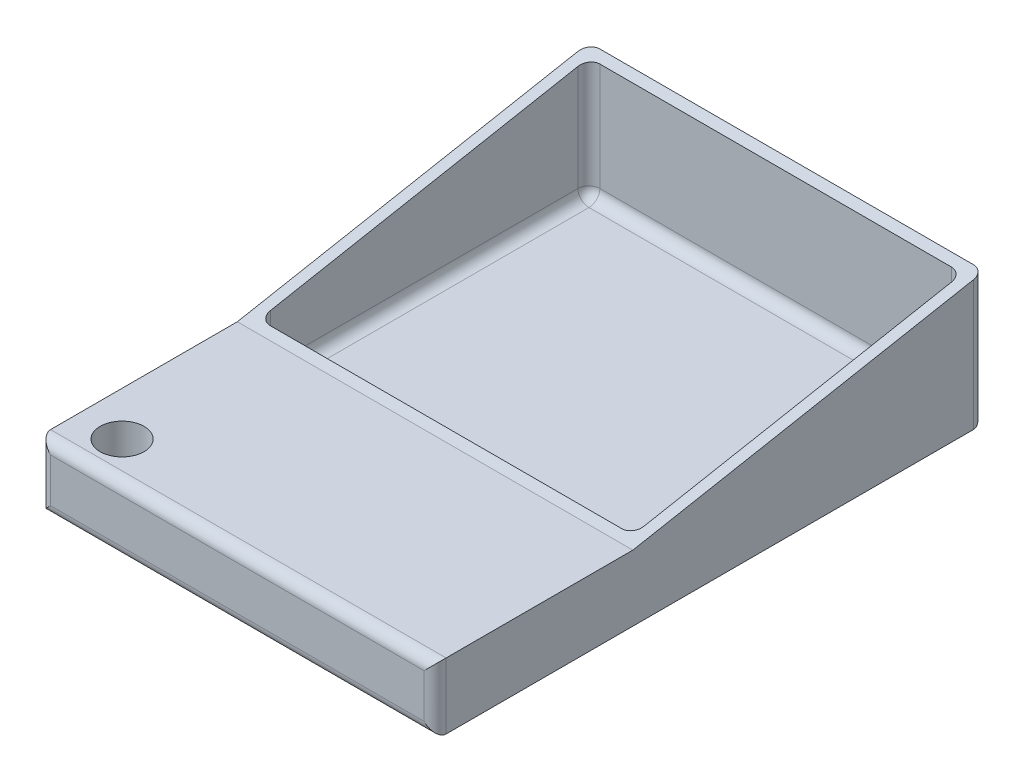
ISO-10303-21;
HEADER;
FILE_DESCRIPTION(('STEP AP214'),'2;1');
FILE_NAME('part.step','',(''),(''),'','','');
FILE_SCHEMA(('AUTOMOTIVE_DESIGN { 1 0 10303 214 1 1 1 1 }'));
ENDSEC;
DATA;
#1=APPLICATION_CONTEXT('core data for automotive mechanical design processes');
#2=APPLICATION_PROTOCOL_DEFINITION('international standard','automotive_design',2000,#1);
#3=PRODUCT_CONTEXT('',#1,'mechanical');
#4=PRODUCT('Part','Part','',(#3));
#5=PRODUCT_RELATED_PRODUCT_CATEGORY('part','',(#4));
#6=PRODUCT_DEFINITION_FORMATION('','',#4);
#7=PRODUCT_DEFINITION_CONTEXT('part definition',#1,'design');
#8=PRODUCT_DEFINITION('design','',#6,#7);
#9=PRODUCT_DEFINITION_SHAPE('','',#8);
#10=(LENGTH_UNIT() NAMED_UNIT(*) SI_UNIT(.MILLI.,.METRE.));
#11=(NAMED_UNIT(*) PLANE_ANGLE_UNIT() SI_UNIT($,.RADIAN.));
#12=(NAMED_UNIT(*) SI_UNIT($,.STERADIAN.) SOLID_ANGLE_UNIT());
#13=UNCERTAINTY_MEASURE_WITH_UNIT(LENGTH_MEASURE(1.E-05),#10,'distance_accuracy_value','');
#14=(GEOMETRIC_REPRESENTATION_CONTEXT(3) GLOBAL_UNCERTAINTY_ASSIGNED_CONTEXT((#13)) GLOBAL_UNIT_ASSIGNED_CONTEXT((#10,
#11,#12)) REPRESENTATION_CONTEXT('',''));
#15=CARTESIAN_POINT('',(0.,0.,0.));
#16=DIRECTION('',(0.,0.,1.));
#17=DIRECTION('',(1.,0.,0.));
#18=AXIS2_PLACEMENT_3D('',#15,#16,#17);
#19=CARTESIAN_POINT('',(90.,30.,-80.));
#20=DIRECTION('',(0.,-0.982872186934322,-0.184288535050185));
#21=DIRECTION('',(0.,0.184288535050185,-0.982872186934322));
#22=AXIS2_PLACEMENT_3D('',#19,#20,#21);
#23=PLANE('',#22);
#24=DIRECTION('',(-1.,0.,0.));
#25=VECTOR('',#24,1.);
#26=CARTESIAN_POINT('',(90.,30.,-80.));
#27=LINE('',#26,#25);
#28=CARTESIAN_POINT('',(87.5,30.,-80.));
#29=VERTEX_POINT('',#28);
#30=CARTESIAN_POINT('',(2.50000000000003,30.,-80.));
#31=VERTEX_POINT('',#30);
#32=EDGE_CURVE('E213',#29,#31,#27,.T.);
#33=ORIENTED_EDGE('',*,*,#32,.T.);
#34=CARTESIAN_POINT('',(2.5,29.53125,-77.5));
#35=DIRECTION('',(0.,-0.982872186934322,-0.184288535050185));
#36=DIRECTION('',(0.,0.184288535050185,-0.982872186934322));
#37=AXIS2_PLACEMENT_3D('',#34,#35,#36);
#38=ELLIPSE('',#37,2.54356571814058,2.5);
#39=CARTESIAN_POINT('',(0.,29.53125,-77.5));
#40=VERTEX_POINT('',#39);
#41=EDGE_CURVE('E191',#31,#40,#38,.F.);
#42=ORIENTED_EDGE('',*,*,#41,.T.);
#43=DIRECTION('',(0.,-0.184288535050185,0.982872186934322));
#44=VECTOR('',#43,1.);
#45=CARTESIAN_POINT('',(0.,30.,-80.));
#46=LINE('',#45,#44);
#47=CARTESIAN_POINT('',(0.,15.,0.));
#48=VERTEX_POINT('',#47);
#49=EDGE_CURVE('E182',#40,#48,#46,.T.);
#50=ORIENTED_EDGE('',*,*,#49,.T.);
#51=DIRECTION('',(-1.,0.,0.));
#52=VECTOR('',#51,1.);
#53=CARTESIAN_POINT('',(90.,15.,0.));
#54=LINE('',#53,#52);
#55=CARTESIAN_POINT('',(90.,15.,0.));
#56=VERTEX_POINT('',#55);
#57=EDGE_CURVE('E188',#56,#48,#54,.T.);
#58=ORIENTED_EDGE('',*,*,#57,.F.);
#59=DIRECTION('',(0.,-0.184288535050185,0.982872186934322));
#60=VECTOR('',#59,1.);
#61=CARTESIAN_POINT('',(90.,30.,-80.));
#62=LINE('',#61,#60);
#63=CARTESIAN_POINT('',(90.,29.53125,-77.5));
#64=VERTEX_POINT('',#63);
#65=EDGE_CURVE('E214',#64,#56,#62,.T.);
#66=ORIENTED_EDGE('',*,*,#65,.F.);
#67=CARTESIAN_POINT('',(87.5,29.53125,-77.5));
#68=DIRECTION('',(0.,-0.982872186934322,-0.184288535050185));
#69=DIRECTION('',(0.,-0.184288535050185,0.982872186934322));
#70=AXIS2_PLACEMENT_3D('',#67,#68,#69);
#71=ELLIPSE('',#70,2.54356571814058,2.5);
#72=EDGE_CURVE('E313',#64,#29,#71,.F.);
#73=ORIENTED_EDGE('',*,*,#72,.T.);
#74=EDGE_LOOP('',(#33,#42,#50,#58,#66,#73));
#75=FACE_BOUND('',#74,.T.);
#76=DIRECTION('',(0.,-0.184288535050185,0.982872186934322));
#77=VECTOR('',#76,1.);
#78=CARTESIAN_POINT('',(2.5,30.,-80.));
#79=LINE('',#78,#77);
#80=CARTESIAN_POINT('',(2.5,29.0625,-75.));
#81=VERTEX_POINT('',#80);
#82=CARTESIAN_POINT('',(2.5,15.9375,-4.99999999999999));
#83=VERTEX_POINT('',#82);
#84=EDGE_CURVE('E413',#81,#83,#79,.T.);
#85=ORIENTED_EDGE('',*,*,#84,.F.);
#86=CARTESIAN_POINT('',(5.,29.0625,-75.));
#87=DIRECTION('',(0.,-0.982872186934322,-0.184288535050185));
#88=DIRECTION('',(0.,-0.184288535050185,0.982872186934322));
#89=AXIS2_PLACEMENT_3D('',#86,#87,#88);
#90=ELLIPSE('',#89,2.54356571814058,2.5);
#91=CARTESIAN_POINT('',(5.,29.53125,-77.5));
#92=VERTEX_POINT('',#91);
#93=EDGE_CURVE('E55',#81,#92,#90,.T.);
#94=ORIENTED_EDGE('',*,*,#93,.T.);
#95=DIRECTION('',(-1.,0.,0.));
#96=VECTOR('',#95,1.);
#97=CARTESIAN_POINT('',(90.,29.53125,-77.5));
#98=LINE('',#97,#96);
#99=CARTESIAN_POINT('',(85.,29.53125,-77.5));
#100=VERTEX_POINT('',#99);
#101=EDGE_CURVE('E405',#100,#92,#98,.T.);
#102=ORIENTED_EDGE('',*,*,#101,.F.);
#103=CARTESIAN_POINT('',(85.,29.0625,-75.));
#104=DIRECTION('',(0.,-0.982872186934322,-0.184288535050185));
#105=DIRECTION('',(0.,0.184288535050185,-0.982872186934322));
#106=AXIS2_PLACEMENT_3D('',#103,#104,#105);
#107=ELLIPSE('',#106,2.54356571814058,2.5);
#108=CARTESIAN_POINT('',(87.5,29.0625,-75.));
#109=VERTEX_POINT('',#108);
#110=EDGE_CURVE('E11',#100,#109,#107,.T.);
#111=ORIENTED_EDGE('',*,*,#110,.T.);
#112=DIRECTION('',(0.,-0.184288535050185,0.982872186934322));
#113=VECTOR('',#112,1.);
#114=CARTESIAN_POINT('',(87.5,30.,-80.));
#115=LINE('',#114,#113);
#116=CARTESIAN_POINT('',(87.5,15.9375,-4.99999999999999));
#117=VERTEX_POINT('',#116);
#118=EDGE_CURVE('E416',#109,#117,#115,.T.);
#119=ORIENTED_EDGE('',*,*,#118,.T.);
#120=CARTESIAN_POINT('',(85.,15.9375,-5.));
#121=DIRECTION('',(0.,-0.982872186934322,-0.184288535050185));
#122=DIRECTION('',(0.,-0.184288535050185,0.982872186934322));
#123=AXIS2_PLACEMENT_3D('',#120,#121,#122);
#124=ELLIPSE('',#123,2.54356571814058,2.5);
#125=CARTESIAN_POINT('',(85.,15.46875,-2.5));
#126=VERTEX_POINT('',#125);
#127=EDGE_CURVE('E321',#117,#126,#124,.T.);
#128=ORIENTED_EDGE('',*,*,#127,.T.);
#129=DIRECTION('',(-1.,0.,0.));
#130=VECTOR('',#129,1.);
#131=CARTESIAN_POINT('',(90.,15.46875,-2.5));
#132=LINE('',#131,#130);
#133=CARTESIAN_POINT('',(5.,15.46875,-2.5));
#134=VERTEX_POINT('',#133);
#135=EDGE_CURVE('E408',#126,#134,#132,.T.);
#136=ORIENTED_EDGE('',*,*,#135,.T.);
#137=CARTESIAN_POINT('',(5.,15.9375,-5.));
#138=DIRECTION('',(0.,-0.982872186934322,-0.184288535050185));
#139=DIRECTION('',(0.,0.184288535050185,-0.982872186934322));
#140=AXIS2_PLACEMENT_3D('',#137,#138,#139);
#141=ELLIPSE('',#140,2.54356571814058,2.5);
#142=EDGE_CURVE('E318',#134,#83,#141,.T.);
#143=ORIENTED_EDGE('',*,*,#142,.T.);
#144=EDGE_LOOP('',(#85,#94,#102,#111,#119,#128,#136,#143));
#145=FACE_BOUND('',#144,.T.);
#146=ADVANCED_FACE('F45',(#75,#145),#23,.F.);
#147=CARTESIAN_POINT('',(90.,0.,0.));
#148=DIRECTION('',(0.,1.,0.));
#149=DIRECTION('',(0.,0.,1.));
#150=AXIS2_PLACEMENT_3D('',#147,#148,#149);
#151=PLANE('',#150);
#152=CARTESIAN_POINT('',(10.,0.,36.22));
#153=DIRECTION('',(0.,-1.,0.));
#154=DIRECTION('',(0.,0.,-1.));
#155=AXIS2_PLACEMENT_3D('',#152,#153,#154);
#156=CIRCLE('',#155,5.);
#157=CARTESIAN_POINT('',(10.,0.,31.22));
#158=VERTEX_POINT('',#157);
#159=EDGE_CURVE('E341',#158,#158,#156,.T.);
#160=ORIENTED_EDGE('',*,*,#159,.F.);
#161=EDGE_LOOP('',(#160));
#162=FACE_BOUND('',#161,.T.);
#163=DIRECTION('',(0.,0.,-1.));
#164=VECTOR('',#163,1.);
#165=CARTESIAN_POINT('',(90.,0.,0.));
#166=LINE('',#165,#164);
#167=CARTESIAN_POINT('',(90.,0.,42.5));
#168=VERTEX_POINT('',#167);
#169=CARTESIAN_POINT('',(90.,0.,-77.5));
#170=VERTEX_POINT('',#169);
#171=EDGE_CURVE('E195',#168,#170,#166,.T.);
#172=ORIENTED_EDGE('',*,*,#171,.F.);
#173=DIRECTION('',(-1.,0.,0.));
#174=VECTOR('',#173,1.);
#175=CARTESIAN_POINT('',(0.,0.,42.5));
#176=LINE('',#175,#174);
#177=CARTESIAN_POINT('',(0.,0.,42.5));
#178=VERTEX_POINT('',#177);
#179=EDGE_CURVE('E252',#168,#178,#176,.T.);
#180=ORIENTED_EDGE('',*,*,#179,.T.);
#181=DIRECTION('',(0.,0.,-1.));
#182=VECTOR('',#181,1.);
#183=CARTESIAN_POINT('',(0.,0.,0.));
#184=LINE('',#183,#182);
#185=CARTESIAN_POINT('',(0.,0.,-77.5));
#186=VERTEX_POINT('',#185);
#187=EDGE_CURVE('E196',#178,#186,#184,.T.);
#188=ORIENTED_EDGE('',*,*,#187,.T.);
#189=DIRECTION('',(-1.,0.,0.));
#190=VECTOR('',#189,1.);
#191=CARTESIAN_POINT('',(90.,0.,-77.5));
#192=LINE('',#191,#190);
#193=EDGE_CURVE('E249',#186,#170,#192,.F.);
#194=ORIENTED_EDGE('',*,*,#193,.T.);
#195=EDGE_LOOP('',(#172,#180,#188,#194));
#196=FACE_BOUND('',#195,.T.);
#197=ADVANCED_FACE('F402',(#162,#196),#151,.F.);
#198=CARTESIAN_POINT('',(90.,0.,-80.));
#199=DIRECTION('',(0.,0.,1.));
#200=DIRECTION('',(1.,0.,0.));
#201=AXIS2_PLACEMENT_3D('',#198,#199,#200);
#202=PLANE('',#201);
#203=DIRECTION('',(-1.,0.,0.));
#204=VECTOR('',#203,1.);
#205=CARTESIAN_POINT('',(90.,2.5,-80.));
#206=LINE('',#205,#204);
#207=CARTESIAN_POINT('',(87.5,2.5,-80.));
#208=VERTEX_POINT('',#207);
#209=CARTESIAN_POINT('',(2.5,2.5,-80.));
#210=VERTEX_POINT('',#209);
#211=EDGE_CURVE('E307',#208,#210,#206,.T.);
#212=ORIENTED_EDGE('',*,*,#211,.T.);
#213=DIRECTION('',(0.,1.,0.));
#214=VECTOR('',#213,1.);
#215=CARTESIAN_POINT('',(2.5,0.,-80.));
#216=LINE('',#215,#214);
#217=EDGE_CURVE('E310',#210,#31,#216,.T.);
#218=ORIENTED_EDGE('',*,*,#217,.T.);
#219=ORIENTED_EDGE('',*,*,#32,.F.);
#220=DIRECTION('',(0.,1.,0.));
#221=VECTOR('',#220,1.);
#222=CARTESIAN_POINT('',(87.5,0.,-80.));
#223=LINE('',#222,#221);
#224=EDGE_CURVE('E71',#29,#208,#223,.F.);
#225=ORIENTED_EDGE('',*,*,#224,.T.);
#226=EDGE_LOOP('',(#212,#218,#219,#225));
#227=FACE_BOUND('',#226,.T.);
#228=ADVANCED_FACE('F397',(#227),#202,.F.);
#229=CARTESIAN_POINT('',(90.,0.,0.));
#230=DIRECTION('',(1.,0.,0.));
#231=DIRECTION('',(0.,0.,-1.));
#232=AXIS2_PLACEMENT_3D('',#229,#230,#231);
#233=PLANE('',#232);
#234=DIRECTION('',(0.,0.,1.));
#235=VECTOR('',#234,1.);
#236=CARTESIAN_POINT('',(90.,15.,0.));
#237=LINE('',#236,#235);
#238=CARTESIAN_POINT('',(90.,15.,42.5));
#239=VERTEX_POINT('',#238);
#240=EDGE_CURVE('E207',#56,#239,#237,.T.);
#241=ORIENTED_EDGE('',*,*,#240,.T.);
#242=DIRECTION('',(0.,-1.,0.));
#243=VECTOR('',#242,1.);
#244=CARTESIAN_POINT('',(90.,0.,42.5));
#245=LINE('',#244,#243);
#246=EDGE_CURVE('E246',#239,#168,#245,.T.);
#247=ORIENTED_EDGE('',*,*,#246,.T.);
#248=ORIENTED_EDGE('',*,*,#171,.T.);
#249=DIRECTION('',(0.,1.,0.));
#250=VECTOR('',#249,1.);
#251=CARTESIAN_POINT('',(90.,30.,-77.5));
#252=LINE('',#251,#250);
#253=EDGE_CURVE('E243',#170,#64,#252,.T.);
#254=ORIENTED_EDGE('',*,*,#253,.T.);
#255=ORIENTED_EDGE('',*,*,#65,.T.);
#256=EDGE_LOOP('',(#241,#247,#248,#254,#255));
#257=FACE_BOUND('',#256,.T.);
#258=ADVANCED_FACE('F395',(#257),#233,.T.);
#259=CARTESIAN_POINT('',(0.,0.,0.));
#260=DIRECTION('',(1.,0.,0.));
#261=DIRECTION('',(0.,0.,-1.));
#262=AXIS2_PLACEMENT_3D('',#259,#260,#261);
#263=PLANE('',#262);
#264=ORIENTED_EDGE('',*,*,#187,.F.);
#265=DIRECTION('',(0.,-1.,0.));
#266=VECTOR('',#265,1.);
#267=CARTESIAN_POINT('',(0.,15.,42.5));
#268=LINE('',#267,#266);
#269=CARTESIAN_POINT('',(0.,15.,42.5));
#270=VERTEX_POINT('',#269);
#271=EDGE_CURVE('E204',#178,#270,#268,.F.);
#272=ORIENTED_EDGE('',*,*,#271,.T.);
#273=DIRECTION('',(0.,0.,-1.));
#274=VECTOR('',#273,1.);
#275=CARTESIAN_POINT('',(0.,15.,0.));
#276=LINE('',#275,#274);
#277=EDGE_CURVE('E200',#270,#48,#276,.T.);
#278=ORIENTED_EDGE('',*,*,#277,.T.);
#279=ORIENTED_EDGE('',*,*,#49,.F.);
#280=DIRECTION('',(0.,1.,0.));
#281=VECTOR('',#280,1.);
#282=CARTESIAN_POINT('',(0.,0.,-77.5));
#283=LINE('',#282,#281);
#284=EDGE_CURVE('E235',#40,#186,#283,.F.);
#285=ORIENTED_EDGE('',*,*,#284,.T.);
#286=EDGE_LOOP('',(#264,#272,#278,#279,#285));
#287=FACE_BOUND('',#286,.T.);
#288=ADVANCED_FACE('F202',(#287),#263,.F.);
#289=CARTESIAN_POINT('',(90.,15.,-2.5));
#290=DIRECTION('',(0.,0.,-1.));
#291=DIRECTION('',(-1.,0.,0.));
#292=AXIS2_PLACEMENT_3D('',#289,#290,#291);
#293=PLANE('',#292);
#294=DIRECTION('',(-1.,0.,0.));
#295=VECTOR('',#294,1.);
#296=CARTESIAN_POINT('',(2.5,5.,-2.5));
#297=LINE('',#296,#295);
#298=CARTESIAN_POINT('',(85.,5.,-2.5));
#299=VERTEX_POINT('',#298);
#300=CARTESIAN_POINT('',(5.,5.,-2.5));
#301=VERTEX_POINT('',#300);
#302=EDGE_CURVE('E290',#299,#301,#297,.T.);
#303=ORIENTED_EDGE('',*,*,#302,.T.);
#304=DIRECTION('',(0.,-1.,0.));
#305=VECTOR('',#304,1.);
#306=CARTESIAN_POINT('',(5.,15.46875,-2.5));
#307=LINE('',#306,#305);
#308=EDGE_CURVE('E293',#301,#134,#307,.F.);
#309=ORIENTED_EDGE('',*,*,#308,.T.);
#310=ORIENTED_EDGE('',*,*,#135,.F.);
#311=DIRECTION('',(0.,-1.,0.));
#312=VECTOR('',#311,1.);
#313=CARTESIAN_POINT('',(85.,15.,-2.5));
#314=LINE('',#313,#312);
#315=EDGE_CURVE('E287',#126,#299,#314,.T.);
#316=ORIENTED_EDGE('',*,*,#315,.T.);
#317=EDGE_LOOP('',(#303,#309,#310,#316));
#318=FACE_BOUND('',#317,.T.);
#319=ADVANCED_FACE('F650',(#318),#293,.T.);
#320=CARTESIAN_POINT('',(90.,2.5,0.));
#321=DIRECTION('',(0.,1.,0.));
#322=DIRECTION('',(0.,0.,1.));
#323=AXIS2_PLACEMENT_3D('',#320,#321,#322);
#324=PLANE('',#323);
#325=DIRECTION('',(0.,0.,-1.));
#326=VECTOR('',#325,1.);
#327=CARTESIAN_POINT('',(85.,2.5,0.));
#328=LINE('',#327,#326);
#329=CARTESIAN_POINT('',(85.,2.5,-5.));
#330=VERTEX_POINT('',#329);
#331=CARTESIAN_POINT('',(85.,2.5,-75.));
#332=VERTEX_POINT('',#331);
#333=EDGE_CURVE('E261',#330,#332,#328,.T.);
#334=ORIENTED_EDGE('',*,*,#333,.T.);
#335=DIRECTION('',(-1.,0.,0.));
#336=VECTOR('',#335,1.);
#337=CARTESIAN_POINT('',(2.5,2.5,-75.));
#338=LINE('',#337,#336);
#339=CARTESIAN_POINT('',(5.,2.5,-75.));
#340=VERTEX_POINT('',#339);
#341=EDGE_CURVE('E264',#332,#340,#338,.T.);
#342=ORIENTED_EDGE('',*,*,#341,.T.);
#343=DIRECTION('',(0.,0.,-1.));
#344=VECTOR('',#343,1.);
#345=CARTESIAN_POINT('',(5.,2.5,-2.5));
#346=LINE('',#345,#344);
#347=CARTESIAN_POINT('',(5.,2.5,-5.));
#348=VERTEX_POINT('',#347);
#349=EDGE_CURVE('E255',#340,#348,#346,.F.);
#350=ORIENTED_EDGE('',*,*,#349,.T.);
#351=DIRECTION('',(-1.,0.,0.));
#352=VECTOR('',#351,1.);
#353=CARTESIAN_POINT('',(87.5,2.5,-5.));
#354=LINE('',#353,#352);
#355=EDGE_CURVE('E258',#348,#330,#354,.F.);
#356=ORIENTED_EDGE('',*,*,#355,.T.);
#357=EDGE_LOOP('',(#334,#342,#350,#356));
#358=FACE_BOUND('',#357,.T.);
#359=ADVANCED_FACE('F641',(#358),#324,.T.);
#360=CARTESIAN_POINT('',(90.,0.,-77.5));
#361=DIRECTION('',(0.,0.,1.));
#362=DIRECTION('',(1.,0.,0.));
#363=AXIS2_PLACEMENT_3D('',#360,#361,#362);
#364=PLANE('',#363);
#365=ORIENTED_EDGE('',*,*,#101,.T.);
#366=DIRECTION('',(0.,1.,0.));
#367=VECTOR('',#366,1.);
#368=CARTESIAN_POINT('',(5.,2.5,-77.5));
#369=LINE('',#368,#367);
#370=CARTESIAN_POINT('',(5.,5.,-77.5));
#371=VERTEX_POINT('',#370);
#372=EDGE_CURVE('E275',#92,#371,#369,.F.);
#373=ORIENTED_EDGE('',*,*,#372,.T.);
#374=DIRECTION('',(-1.,0.,0.));
#375=VECTOR('',#374,1.);
#376=CARTESIAN_POINT('',(87.5,5.,-77.5));
#377=LINE('',#376,#375);
#378=CARTESIAN_POINT('',(85.,5.,-77.5));
#379=VERTEX_POINT('',#378);
#380=EDGE_CURVE('E271',#371,#379,#377,.F.);
#381=ORIENTED_EDGE('',*,*,#380,.T.);
#382=DIRECTION('',(0.,1.,0.));
#383=VECTOR('',#382,1.);
#384=CARTESIAN_POINT('',(85.,0.,-77.5));
#385=LINE('',#384,#383);
#386=EDGE_CURVE('E268',#379,#100,#385,.T.);
#387=ORIENTED_EDGE('',*,*,#386,.T.);
#388=EDGE_LOOP('',(#365,#373,#381,#387));
#389=FACE_BOUND('',#388,.T.);
#390=ADVANCED_FACE('F632',(#389),#364,.T.);
#391=CARTESIAN_POINT('',(87.5,0.,0.));
#392=DIRECTION('',(1.,0.,0.));
#393=DIRECTION('',(0.,0.,-1.));
#394=AXIS2_PLACEMENT_3D('',#391,#392,#393);
#395=PLANE('',#394);
#396=DIRECTION('',(0.,0.,-1.));
#397=VECTOR('',#396,1.);
#398=CARTESIAN_POINT('',(87.5,5.,0.));
#399=LINE('',#398,#397);
#400=CARTESIAN_POINT('',(87.5,5.,-75.));
#401=VERTEX_POINT('',#400);
#402=CARTESIAN_POINT('',(87.5,5.,-5.));
#403=VERTEX_POINT('',#402);
#404=EDGE_CURVE('E281',#401,#403,#399,.F.);
#405=ORIENTED_EDGE('',*,*,#404,.T.);
#406=DIRECTION('',(0.,-1.,0.));
#407=VECTOR('',#406,1.);
#408=CARTESIAN_POINT('',(87.5,0.,-5.));
#409=LINE('',#408,#407);
#410=EDGE_CURVE('E284',#403,#117,#409,.F.);
#411=ORIENTED_EDGE('',*,*,#410,.T.);
#412=ORIENTED_EDGE('',*,*,#118,.F.);
#413=DIRECTION('',(0.,1.,0.));
#414=VECTOR('',#413,1.);
#415=CARTESIAN_POINT('',(87.5,0.,-75.));
#416=LINE('',#415,#414);
#417=EDGE_CURVE('E278',#109,#401,#416,.F.);
#418=ORIENTED_EDGE('',*,*,#417,.T.);
#419=EDGE_LOOP('',(#405,#411,#412,#418));
#420=FACE_BOUND('',#419,.T.);
#421=ADVANCED_FACE('F623',(#420),#395,.F.);
#422=CARTESIAN_POINT('',(2.5,0.,0.));
#423=DIRECTION('',(1.,0.,0.));
#424=DIRECTION('',(0.,0.,-1.));
#425=AXIS2_PLACEMENT_3D('',#422,#423,#424);
#426=PLANE('',#425);
#427=ORIENTED_EDGE('',*,*,#84,.T.);
#428=DIRECTION('',(0.,-1.,0.));
#429=VECTOR('',#428,1.);
#430=CARTESIAN_POINT('',(2.5,2.5,-5.));
#431=LINE('',#430,#429);
#432=CARTESIAN_POINT('',(2.5,5.,-5.));
#433=VERTEX_POINT('',#432);
#434=EDGE_CURVE('E302',#83,#433,#431,.T.);
#435=ORIENTED_EDGE('',*,*,#434,.T.);
#436=DIRECTION('',(0.,0.,-1.));
#437=VECTOR('',#436,1.);
#438=CARTESIAN_POINT('',(2.5,5.,-77.5));
#439=LINE('',#438,#437);
#440=CARTESIAN_POINT('',(2.5,5.,-75.));
#441=VERTEX_POINT('',#440);
#442=EDGE_CURVE('E299',#433,#441,#439,.T.);
#443=ORIENTED_EDGE('',*,*,#442,.T.);
#444=DIRECTION('',(0.,1.,0.));
#445=VECTOR('',#444,1.);
#446=CARTESIAN_POINT('',(2.5,29.53125,-75.));
#447=LINE('',#446,#445);
#448=EDGE_CURVE('E296',#441,#81,#447,.T.);
#449=ORIENTED_EDGE('',*,*,#448,.T.);
#450=EDGE_LOOP('',(#427,#435,#443,#449));
#451=FACE_BOUND('',#450,.T.);
#452=ADVANCED_FACE('F613',(#451),#426,.T.);
#453=CARTESIAN_POINT('',(0.,15.,45.));
#454=DIRECTION('',(0.,0.,1.));
#455=DIRECTION('',(1.,0.,0.));
#456=AXIS2_PLACEMENT_3D('',#453,#454,#455);
#457=PLANE('',#456);
#458=DIRECTION('',(-1.,0.,0.));
#459=VECTOR('',#458,1.);
#460=CARTESIAN_POINT('',(0.,12.5,45.));
#461=LINE('',#460,#459);
#462=CARTESIAN_POINT('',(87.5,12.5,45.));
#463=VERTEX_POINT('',#462);
#464=CARTESIAN_POINT('',(2.5,12.5,45.));
#465=VERTEX_POINT('',#464);
#466=EDGE_CURVE('E228',#463,#465,#461,.T.);
#467=ORIENTED_EDGE('',*,*,#466,.T.);
#468=DIRECTION('',(0.,-1.,0.));
#469=VECTOR('',#468,1.);
#470=CARTESIAN_POINT('',(2.5,0.,45.));
#471=LINE('',#470,#469);
#472=CARTESIAN_POINT('',(2.5,2.5,45.));
#473=VERTEX_POINT('',#472);
#474=EDGE_CURVE('E231',#465,#473,#471,.T.);
#475=ORIENTED_EDGE('',*,*,#474,.T.);
#476=DIRECTION('',(-1.,0.,0.));
#477=VECTOR('',#476,1.);
#478=CARTESIAN_POINT('',(90.,2.5,45.));
#479=LINE('',#478,#477);
#480=CARTESIAN_POINT('',(87.5,2.5,45.));
#481=VERTEX_POINT('',#480);
#482=EDGE_CURVE('E218',#473,#481,#479,.F.);
#483=ORIENTED_EDGE('',*,*,#482,.T.);
#484=DIRECTION('',(0.,-1.,0.));
#485=VECTOR('',#484,1.);
#486=CARTESIAN_POINT('',(87.5,15.,45.));
#487=LINE('',#486,#485);
#488=EDGE_CURVE('E225',#481,#463,#487,.F.);
#489=ORIENTED_EDGE('',*,*,#488,.T.);
#490=EDGE_LOOP('',(#467,#475,#483,#489));
#491=FACE_BOUND('',#490,.T.);
#492=ADVANCED_FACE('F604',(#491),#457,.T.);
#493=CARTESIAN_POINT('',(0.,15.,0.));
#494=DIRECTION('',(0.,1.,0.));
#495=DIRECTION('',(0.,0.,1.));
#496=AXIS2_PLACEMENT_3D('',#493,#494,#495);
#497=PLANE('',#496);
#498=CARTESIAN_POINT('',(10.,15.,36.22));
#499=DIRECTION('',(0.,1.,0.));
#500=DIRECTION('',(0.,0.,1.));
#501=AXIS2_PLACEMENT_3D('',#498,#499,#500);
#502=CIRCLE('',#501,5.);
#503=CARTESIAN_POINT('',(10.,15.,41.22));
#504=VERTEX_POINT('',#503);
#505=EDGE_CURVE('E208',#504,#504,#502,.T.);
#506=ORIENTED_EDGE('',*,*,#505,.F.);
#507=EDGE_LOOP('',(#506));
#508=FACE_BOUND('',#507,.T.);
#509=ORIENTED_EDGE('',*,*,#277,.F.);
#510=DIRECTION('',(-1.,0.,0.));
#511=VECTOR('',#510,1.);
#512=CARTESIAN_POINT('',(0.,15.,42.5));
#513=LINE('',#512,#511);
#514=EDGE_CURVE('E240',#270,#239,#513,.F.);
#515=ORIENTED_EDGE('',*,*,#514,.T.);
#516=ORIENTED_EDGE('',*,*,#240,.F.);
#517=ORIENTED_EDGE('',*,*,#57,.T.);
#518=EDGE_LOOP('',(#509,#515,#516,#517));
#519=FACE_BOUND('',#518,.T.);
#520=ADVANCED_FACE('F210',(#508,#519),#497,.T.);
#521=CARTESIAN_POINT('',(10.,0.,36.22));
#522=DIRECTION('',(0.,-1.,0.));
#523=DIRECTION('',(0.,0.,-1.));
#524=AXIS2_PLACEMENT_3D('',#521,#522,#523);
#525=CYLINDRICAL_SURFACE('',#524,5.);
#526=ORIENTED_EDGE('',*,*,#159,.T.);
#527=EDGE_LOOP('',(#526));
#528=FACE_BOUND('',#527,.T.);
#529=ORIENTED_EDGE('',*,*,#505,.T.);
#530=EDGE_LOOP('',(#529));
#531=FACE_BOUND('',#530,.T.);
#532=ADVANCED_FACE('F433',(#528,#531),#525,.F.);
#533=CARTESIAN_POINT('',(87.5,0.,42.5));
#534=DIRECTION('',(0.,-1.,0.));
#535=DIRECTION('',(0.,0.,-1.));
#536=AXIS2_PLACEMENT_3D('',#533,#534,#535);
#537=CYLINDRICAL_SURFACE('',#536,2.5);
#538=CARTESIAN_POINT('',(87.5,2.5,42.5));
#539=DIRECTION('',(0.707106781186547,0.707106781186547,0.));
#540=DIRECTION('',(0.707106781186547,-0.707106781186547,0.));
#541=AXIS2_PLACEMENT_3D('',#538,#539,#540);
#542=ELLIPSE('',#541,3.53553390593274,2.5);
#543=EDGE_CURVE('E333',#168,#481,#542,.F.);
#544=ORIENTED_EDGE('',*,*,#543,.F.);
#545=ORIENTED_EDGE('',*,*,#246,.F.);
#546=CARTESIAN_POINT('',(87.5,12.5,42.5));
#547=DIRECTION('',(0.707106781186547,-0.707106781186547,0.));
#548=DIRECTION('',(-0.707106781186547,-0.707106781186547,0.));
#549=AXIS2_PLACEMENT_3D('',#546,#547,#548);
#550=ELLIPSE('',#549,3.53553390593274,2.5);
#551=EDGE_CURVE('E337',#463,#239,#550,.F.);
#552=ORIENTED_EDGE('',*,*,#551,.F.);
#553=ORIENTED_EDGE('',*,*,#488,.F.);
#554=EDGE_LOOP('',(#544,#545,#552,#553));
#555=FACE_BOUND('',#554,.T.);
#556=ADVANCED_FACE('F457',(#555),#537,.T.);
#557=CARTESIAN_POINT('',(0.,12.5,42.5));
#558=DIRECTION('',(-1.,0.,0.));
#559=DIRECTION('',(0.,0.,1.));
#560=AXIS2_PLACEMENT_3D('',#557,#558,#559);
#561=CYLINDRICAL_SURFACE('',#560,2.5);
#562=ORIENTED_EDGE('',*,*,#551,.T.);
#563=ORIENTED_EDGE('',*,*,#514,.F.);
#564=CARTESIAN_POINT('',(2.5,12.5,42.5));
#565=DIRECTION('',(-0.707106781186547,-0.707106781186547,0.));
#566=DIRECTION('',(-0.707106781186547,0.707106781186547,0.));
#567=AXIS2_PLACEMENT_3D('',#564,#565,#566);
#568=ELLIPSE('',#567,3.53553390593274,2.5);
#569=EDGE_CURVE('E329',#465,#270,#568,.T.);
#570=ORIENTED_EDGE('',*,*,#569,.F.);
#571=ORIENTED_EDGE('',*,*,#466,.F.);
#572=EDGE_LOOP('',(#562,#563,#570,#571));
#573=FACE_BOUND('',#572,.T.);
#574=ADVANCED_FACE('F453',(#573),#561,.T.);
#575=CARTESIAN_POINT('',(90.,2.5,42.5));
#576=DIRECTION('',(1.,0.,0.));
#577=DIRECTION('',(0.,0.,-1.));
#578=AXIS2_PLACEMENT_3D('',#575,#576,#577);
#579=CYLINDRICAL_SURFACE('',#578,2.5);
#580=ORIENTED_EDGE('',*,*,#543,.T.);
#581=ORIENTED_EDGE('',*,*,#482,.F.);
#582=CARTESIAN_POINT('',(2.5,2.5,42.5));
#583=DIRECTION('',(0.707106781186547,-0.707106781186547,0.));
#584=DIRECTION('',(0.707106781186547,0.707106781186547,0.));
#585=AXIS2_PLACEMENT_3D('',#582,#583,#584);
#586=ELLIPSE('',#585,3.53553390593274,2.5);
#587=EDGE_CURVE('E326',#178,#473,#586,.F.);
#588=ORIENTED_EDGE('',*,*,#587,.F.);
#589=ORIENTED_EDGE('',*,*,#179,.F.);
#590=EDGE_LOOP('',(#580,#581,#588,#589));
#591=FACE_BOUND('',#590,.T.);
#592=ADVANCED_FACE('F449',(#591),#579,.T.);
#593=CARTESIAN_POINT('',(2.5,15.,42.5));
#594=DIRECTION('',(0.,1.,0.));
#595=DIRECTION('',(0.,0.,1.));
#596=AXIS2_PLACEMENT_3D('',#593,#594,#595);
#597=CYLINDRICAL_SURFACE('',#596,2.5);
#598=ORIENTED_EDGE('',*,*,#569,.T.);
#599=ORIENTED_EDGE('',*,*,#271,.F.);
#600=ORIENTED_EDGE('',*,*,#587,.T.);
#601=ORIENTED_EDGE('',*,*,#474,.F.);
#602=EDGE_LOOP('',(#598,#599,#600,#601));
#603=FACE_BOUND('',#602,.T.);
#604=ADVANCED_FACE('F445',(#603),#597,.T.);
#605=CARTESIAN_POINT('',(85.,15.,-5.));
#606=DIRECTION('',(0.,-1.,0.));
#607=DIRECTION('',(0.,0.,-1.));
#608=AXIS2_PLACEMENT_3D('',#605,#606,#607);
#609=CYLINDRICAL_SURFACE('',#608,2.5);
#610=ORIENTED_EDGE('',*,*,#127,.F.);
#611=ORIENTED_EDGE('',*,*,#410,.F.);
#612=CARTESIAN_POINT('',(85.,5.,-5.));
#613=DIRECTION('',(0.,1.,0.));
#614=DIRECTION('',(-1.,0.,0.));
#615=AXIS2_PLACEMENT_3D('',#612,#613,#614);
#616=CIRCLE('',#615,2.5);
#617=EDGE_CURVE('E330',#299,#403,#616,.T.);
#618=ORIENTED_EDGE('',*,*,#617,.F.);
#619=ORIENTED_EDGE('',*,*,#315,.F.);
#620=EDGE_LOOP('',(#610,#611,#618,#619));
#621=FACE_BOUND('',#620,.T.);
#622=ADVANCED_FACE('F448',(#621),#609,.F.);
#623=CARTESIAN_POINT('',(90.,5.,-5.));
#624=DIRECTION('',(1.,0.,0.));
#625=DIRECTION('',(0.,0.,-1.));
#626=AXIS2_PLACEMENT_3D('',#623,#624,#625);
#627=CYLINDRICAL_SURFACE('',#626,2.5);
#628=CARTESIAN_POINT('',(5.,5.,-5.));
#629=DIRECTION('',(1.,0.,0.));
#630=DIRECTION('',(0.,0.,-1.));
#631=AXIS2_PLACEMENT_3D('',#628,#629,#630);
#632=CIRCLE('',#631,2.5);
#633=EDGE_CURVE('E376',#301,#348,#632,.T.);
#634=ORIENTED_EDGE('',*,*,#633,.F.);
#635=ORIENTED_EDGE('',*,*,#302,.F.);
#636=CARTESIAN_POINT('',(85.,5.,-5.));
#637=DIRECTION('',(-1.,0.,0.));
#638=DIRECTION('',(0.,0.,1.));
#639=AXIS2_PLACEMENT_3D('',#636,#637,#638);
#640=CIRCLE('',#639,2.5);
#641=EDGE_CURVE('E380',#330,#299,#640,.T.);
#642=ORIENTED_EDGE('',*,*,#641,.F.);
#643=ORIENTED_EDGE('',*,*,#355,.F.);
#644=EDGE_LOOP('',(#634,#635,#642,#643));
#645=FACE_BOUND('',#644,.T.);
#646=ADVANCED_FACE('F501',(#645),#627,.F.);
#647=CARTESIAN_POINT('',(5.,0.,-5.));
#648=DIRECTION('',(0.,1.,0.));
#649=DIRECTION('',(0.,0.,1.));
#650=AXIS2_PLACEMENT_3D('',#647,#648,#649);
#651=CYLINDRICAL_SURFACE('',#650,2.5);
#652=ORIENTED_EDGE('',*,*,#142,.F.);
#653=ORIENTED_EDGE('',*,*,#308,.F.);
#654=CARTESIAN_POINT('',(5.,5.,-5.));
#655=DIRECTION('',(0.,1.,0.));
#656=DIRECTION('',(0.,0.,1.));
#657=AXIS2_PLACEMENT_3D('',#654,#655,#656);
#658=CIRCLE('',#657,2.5);
#659=EDGE_CURVE('E372',#433,#301,#658,.T.);
#660=ORIENTED_EDGE('',*,*,#659,.F.);
#661=ORIENTED_EDGE('',*,*,#434,.F.);
#662=EDGE_LOOP('',(#652,#653,#660,#661));
#663=FACE_BOUND('',#662,.T.);
#664=ADVANCED_FACE('F497',(#663),#651,.F.);
#665=CARTESIAN_POINT('',(85.,5.,-5.));
#666=DIRECTION('',(0.,0.,1.));
#667=DIRECTION('',(0.,-1.,0.));
#668=AXIS2_PLACEMENT_3D('',#665,#666,#667);
#669=SPHERICAL_SURFACE('',#668,2.5);
#670=ORIENTED_EDGE('',*,*,#641,.T.);
#671=ORIENTED_EDGE('',*,*,#617,.T.);
#672=CARTESIAN_POINT('',(85.,5.,-5.));
#673=DIRECTION('',(0.,0.,-1.));
#674=DIRECTION('',(-1.,0.,0.));
#675=AXIS2_PLACEMENT_3D('',#672,#673,#674);
#676=CIRCLE('',#675,2.5);
#677=EDGE_CURVE('E368',#330,#403,#676,.F.);
#678=ORIENTED_EDGE('',*,*,#677,.F.);
#679=EDGE_LOOP('',(#670,#671,#678));
#680=FACE_BOUND('',#679,.T.);
#681=ADVANCED_FACE('F493',(#680),#669,.F.);
#682=CARTESIAN_POINT('',(5.,5.,-5.));
#683=DIRECTION('',(0.,0.,1.));
#684=DIRECTION('',(0.,-1.,0.));
#685=AXIS2_PLACEMENT_3D('',#682,#683,#684);
#686=SPHERICAL_SURFACE('',#685,2.5);
#687=ORIENTED_EDGE('',*,*,#659,.T.);
#688=ORIENTED_EDGE('',*,*,#633,.T.);
#689=CARTESIAN_POINT('',(5.,5.,-5.));
#690=DIRECTION('',(0.,0.,-1.));
#691=DIRECTION('',(-1.,0.,0.));
#692=AXIS2_PLACEMENT_3D('',#689,#690,#691);
#693=CIRCLE('',#692,2.5);
#694=EDGE_CURVE('E364',#433,#348,#693,.F.);
#695=ORIENTED_EDGE('',*,*,#694,.F.);
#696=EDGE_LOOP('',(#687,#688,#695));
#697=FACE_BOUND('',#696,.T.);
#698=ADVANCED_FACE('F489',(#697),#686,.F.);
#699=CARTESIAN_POINT('',(85.,0.,-75.));
#700=DIRECTION('',(0.,1.,0.));
#701=DIRECTION('',(0.,0.,1.));
#702=AXIS2_PLACEMENT_3D('',#699,#700,#701);
#703=CYLINDRICAL_SURFACE('',#702,2.5);
#704=ORIENTED_EDGE('',*,*,#110,.F.);
#705=ORIENTED_EDGE('',*,*,#386,.F.);
#706=CARTESIAN_POINT('',(85.,5.,-75.));
#707=DIRECTION('',(0.,1.,0.));
#708=DIRECTION('',(0.,0.,1.));
#709=AXIS2_PLACEMENT_3D('',#706,#707,#708);
#710=CIRCLE('',#709,2.5);
#711=EDGE_CURVE('E360',#401,#379,#710,.T.);
#712=ORIENTED_EDGE('',*,*,#711,.F.);
#713=ORIENTED_EDGE('',*,*,#417,.F.);
#714=EDGE_LOOP('',(#704,#705,#712,#713));
#715=FACE_BOUND('',#714,.T.);
#716=ADVANCED_FACE('F485',(#715),#703,.F.);
#717=CARTESIAN_POINT('',(85.,5.,0.));
#718=DIRECTION('',(0.,0.,-1.));
#719=DIRECTION('',(-1.,0.,0.));
#720=AXIS2_PLACEMENT_3D('',#717,#718,#719);
#721=CYLINDRICAL_SURFACE('',#720,2.5);
#722=ORIENTED_EDGE('',*,*,#677,.T.);
#723=ORIENTED_EDGE('',*,*,#404,.F.);
#724=CARTESIAN_POINT('',(85.,5.,-75.));
#725=DIRECTION('',(0.,0.,1.));
#726=DIRECTION('',(1.,0.,0.));
#727=AXIS2_PLACEMENT_3D('',#724,#725,#726);
#728=CIRCLE('',#727,2.5);
#729=EDGE_CURVE('E356',#332,#401,#728,.T.);
#730=ORIENTED_EDGE('',*,*,#729,.F.);
#731=ORIENTED_EDGE('',*,*,#333,.F.);
#732=EDGE_LOOP('',(#722,#723,#730,#731));
#733=FACE_BOUND('',#732,.T.);
#734=ADVANCED_FACE('F481',(#733),#721,.F.);
#735=CARTESIAN_POINT('',(5.,5.,0.));
#736=DIRECTION('',(0.,0.,1.));
#737=DIRECTION('',(1.,0.,0.));
#738=AXIS2_PLACEMENT_3D('',#735,#736,#737);
#739=CYLINDRICAL_SURFACE('',#738,2.5);
#740=ORIENTED_EDGE('',*,*,#694,.T.);
#741=ORIENTED_EDGE('',*,*,#349,.F.);
#742=CARTESIAN_POINT('',(5.,5.,-75.));
#743=DIRECTION('',(0.,0.,1.));
#744=DIRECTION('',(0.,-1.,0.));
#745=AXIS2_PLACEMENT_3D('',#742,#743,#744);
#746=CIRCLE('',#745,2.5);
#747=EDGE_CURVE('E352',#441,#340,#746,.T.);
#748=ORIENTED_EDGE('',*,*,#747,.F.);
#749=ORIENTED_EDGE('',*,*,#442,.F.);
#750=EDGE_LOOP('',(#740,#741,#748,#749));
#751=FACE_BOUND('',#750,.T.);
#752=ADVANCED_FACE('F477',(#751),#739,.F.);
#753=CARTESIAN_POINT('',(5.,0.,-75.));
#754=DIRECTION('',(0.,-1.,0.));
#755=DIRECTION('',(0.,0.,-1.));
#756=AXIS2_PLACEMENT_3D('',#753,#754,#755);
#757=CYLINDRICAL_SURFACE('',#756,2.5);
#758=ORIENTED_EDGE('',*,*,#93,.F.);
#759=ORIENTED_EDGE('',*,*,#448,.F.);
#760=CARTESIAN_POINT('',(5.,5.,-75.));
#761=DIRECTION('',(0.,1.,0.));
#762=DIRECTION('',(0.,0.,1.));
#763=AXIS2_PLACEMENT_3D('',#760,#761,#762);
#764=CIRCLE('',#763,2.5);
#765=EDGE_CURVE('E348',#371,#441,#764,.T.);
#766=ORIENTED_EDGE('',*,*,#765,.F.);
#767=ORIENTED_EDGE('',*,*,#372,.F.);
#768=EDGE_LOOP('',(#758,#759,#766,#767));
#769=FACE_BOUND('',#768,.T.);
#770=ADVANCED_FACE('F473',(#769),#757,.F.);
#771=CARTESIAN_POINT('',(85.,5.,-75.));
#772=DIRECTION('',(1.,0.,0.));
#773=DIRECTION('',(0.,0.,-1.));
#774=AXIS2_PLACEMENT_3D('',#771,#772,#773);
#775=SPHERICAL_SURFACE('',#774,2.5);
#776=ORIENTED_EDGE('',*,*,#729,.T.);
#777=ORIENTED_EDGE('',*,*,#711,.T.);
#778=CARTESIAN_POINT('',(85.,5.,-75.));
#779=DIRECTION('',(-1.,0.,0.));
#780=DIRECTION('',(0.,0.,1.));
#781=AXIS2_PLACEMENT_3D('',#778,#779,#780);
#782=CIRCLE('',#781,2.5);
#783=EDGE_CURVE('E345',#332,#379,#782,.F.);
#784=ORIENTED_EDGE('',*,*,#783,.F.);
#785=EDGE_LOOP('',(#776,#777,#784));
#786=FACE_BOUND('',#785,.T.);
#787=ADVANCED_FACE('F469',(#786),#775,.F.);
#788=CARTESIAN_POINT('',(5.,5.,-75.));
#789=DIRECTION('',(-1.,0.,0.));
#790=DIRECTION('',(0.,0.,1.));
#791=AXIS2_PLACEMENT_3D('',#788,#789,#790);
#792=SPHERICAL_SURFACE('',#791,2.5);
#793=ORIENTED_EDGE('',*,*,#765,.T.);
#794=ORIENTED_EDGE('',*,*,#747,.T.);
#795=CARTESIAN_POINT('',(5.,5.,-75.));
#796=DIRECTION('',(1.,0.,0.));
#797=DIRECTION('',(0.,0.,-1.));
#798=AXIS2_PLACEMENT_3D('',#795,#796,#797);
#799=CIRCLE('',#798,2.5);
#800=EDGE_CURVE('E342',#371,#340,#799,.F.);
#801=ORIENTED_EDGE('',*,*,#800,.F.);
#802=EDGE_LOOP('',(#793,#794,#801));
#803=FACE_BOUND('',#802,.T.);
#804=ADVANCED_FACE('F465',(#803),#792,.F.);
#805=CARTESIAN_POINT('',(90.,5.,-75.));
#806=DIRECTION('',(1.,0.,0.));
#807=DIRECTION('',(0.,0.,-1.));
#808=AXIS2_PLACEMENT_3D('',#805,#806,#807);
#809=CYLINDRICAL_SURFACE('',#808,2.5);
#810=ORIENTED_EDGE('',*,*,#783,.T.);
#811=ORIENTED_EDGE('',*,*,#380,.F.);
#812=ORIENTED_EDGE('',*,*,#800,.T.);
#813=ORIENTED_EDGE('',*,*,#341,.F.);
#814=EDGE_LOOP('',(#810,#811,#812,#813));
#815=FACE_BOUND('',#814,.T.);
#816=ADVANCED_FACE('F462',(#815),#809,.F.);
#817=CARTESIAN_POINT('',(87.5,0.,-77.5));
#818=DIRECTION('',(0.,-1.,0.));
#819=DIRECTION('',(0.,0.,-1.));
#820=AXIS2_PLACEMENT_3D('',#817,#818,#819);
#821=CYLINDRICAL_SURFACE('',#820,2.5);
#822=ORIENTED_EDGE('',*,*,#72,.F.);
#823=ORIENTED_EDGE('',*,*,#253,.F.);
#824=CARTESIAN_POINT('',(87.5,2.5,-77.5));
#825=DIRECTION('',(-0.707106781186547,-0.707106781186547,0.));
#826=DIRECTION('',(0.707106781186547,-0.707106781186547,0.));
#827=AXIS2_PLACEMENT_3D('',#824,#825,#826);
#828=ELLIPSE('',#827,3.53553390593274,2.5);
#829=EDGE_CURVE('E49',#208,#170,#828,.T.);
#830=ORIENTED_EDGE('',*,*,#829,.F.);
#831=ORIENTED_EDGE('',*,*,#224,.F.);
#832=EDGE_LOOP('',(#822,#823,#830,#831));
#833=FACE_BOUND('',#832,.T.);
#834=ADVANCED_FACE('F47',(#833),#821,.T.);
#835=CARTESIAN_POINT('',(2.5,0.,-77.5));
#836=DIRECTION('',(0.,1.,0.));
#837=DIRECTION('',(0.,0.,1.));
#838=AXIS2_PLACEMENT_3D('',#835,#836,#837);
#839=CYLINDRICAL_SURFACE('',#838,2.5);
#840=ORIENTED_EDGE('',*,*,#41,.F.);
#841=ORIENTED_EDGE('',*,*,#217,.F.);
#842=CARTESIAN_POINT('',(2.5,2.5,-77.5));
#843=DIRECTION('',(-0.707106781186547,0.707106781186547,0.));
#844=DIRECTION('',(0.707106781186547,0.707106781186547,0.));
#845=AXIS2_PLACEMENT_3D('',#842,#843,#844);
#846=ELLIPSE('',#845,3.53553390593274,2.5);
#847=EDGE_CURVE('E63',#186,#210,#846,.F.);
#848=ORIENTED_EDGE('',*,*,#847,.F.);
#849=ORIENTED_EDGE('',*,*,#284,.F.);
#850=EDGE_LOOP('',(#840,#841,#848,#849));
#851=FACE_BOUND('',#850,.T.);
#852=ADVANCED_FACE('F399',(#851),#839,.T.);
#853=CARTESIAN_POINT('',(90.,2.5,-77.5));
#854=DIRECTION('',(-1.,0.,0.));
#855=DIRECTION('',(0.,0.,1.));
#856=AXIS2_PLACEMENT_3D('',#853,#854,#855);
#857=CYLINDRICAL_SURFACE('',#856,2.5);
#858=ORIENTED_EDGE('',*,*,#829,.T.);
#859=ORIENTED_EDGE('',*,*,#193,.F.);
#860=ORIENTED_EDGE('',*,*,#847,.T.);
#861=ORIENTED_EDGE('',*,*,#211,.F.);
#862=EDGE_LOOP('',(#858,#859,#860,#861));
#863=FACE_BOUND('',#862,.T.);
#864=ADVANCED_FACE('F389',(#863),#857,.T.);
#865=CLOSED_SHELL('',(#146,#197,#228,#258,#288,#319,#359,#390,#421,#452,#492,#520,#532,#556,
#574,#592,#604,#622,#646,#664,#681,#698,#716,#734,#752,#770,#787,#804,#816,#834,#852,#864));
#866=MANIFOLD_SOLID_BREP('B2',#865);
#867=ADVANCED_BREP_SHAPE_REPRESENTATION('',(#18,#866),#14);
#868=SHAPE_DEFINITION_REPRESENTATION(#9,#867);
ENDSEC;
END-ISO-10303-21;
